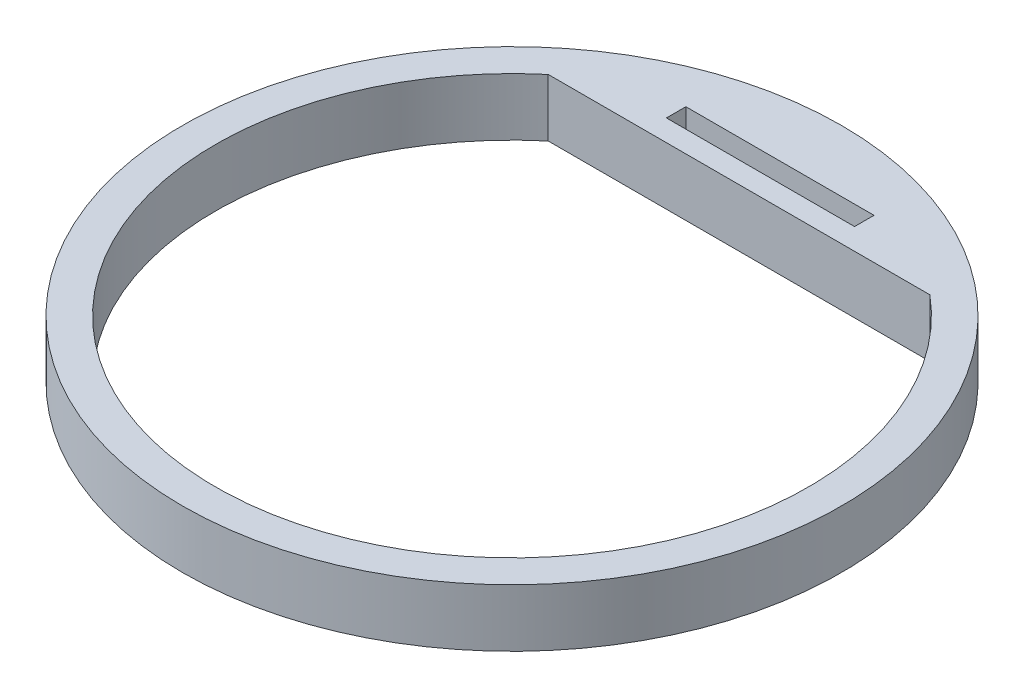
ISO-10303-21;
HEADER;
FILE_DESCRIPTION(('STEP AP214'),'2;1');
FILE_NAME('part.step','',(''),(''),'','','');
FILE_SCHEMA(('AUTOMOTIVE_DESIGN { 1 0 10303 214 1 1 1 1 }'));
ENDSEC;
DATA;
#1=APPLICATION_CONTEXT('core data for automotive mechanical design processes');
#2=APPLICATION_PROTOCOL_DEFINITION('international standard','automotive_design',2000,#1);
#3=PRODUCT_CONTEXT('',#1,'mechanical');
#4=PRODUCT('Part','Part','',(#3));
#5=PRODUCT_RELATED_PRODUCT_CATEGORY('part','',(#4));
#6=PRODUCT_DEFINITION_FORMATION('','',#4);
#7=PRODUCT_DEFINITION_CONTEXT('part definition',#1,'design');
#8=PRODUCT_DEFINITION('design','',#6,#7);
#9=PRODUCT_DEFINITION_SHAPE('','',#8);
#10=(LENGTH_UNIT() NAMED_UNIT(*) SI_UNIT(.MILLI.,.METRE.));
#11=(NAMED_UNIT(*) PLANE_ANGLE_UNIT() SI_UNIT($,.RADIAN.));
#12=(NAMED_UNIT(*) SI_UNIT($,.STERADIAN.) SOLID_ANGLE_UNIT());
#13=UNCERTAINTY_MEASURE_WITH_UNIT(LENGTH_MEASURE(1.E-05),#10,'distance_accuracy_value','');
#14=(GEOMETRIC_REPRESENTATION_CONTEXT(3) GLOBAL_UNCERTAINTY_ASSIGNED_CONTEXT((#13)) GLOBAL_UNIT_ASSIGNED_CONTEXT((#10,
#11,#12)) REPRESENTATION_CONTEXT('',''));
#15=CARTESIAN_POINT('',(0.,0.,0.));
#16=DIRECTION('',(0.,0.,1.));
#17=DIRECTION('',(1.,0.,0.));
#18=AXIS2_PLACEMENT_3D('',#15,#16,#17);
#19=CARTESIAN_POINT('',(0.,8.89,0.));
#20=DIRECTION('',(0.,-1.,0.));
#21=DIRECTION('',(0.,0.,-1.));
#22=AXIS2_PLACEMENT_3D('',#19,#20,#21);
#23=CYLINDRICAL_SURFACE('',#22,45.72);
#24=CARTESIAN_POINT('',(0.,0.,0.));
#25=DIRECTION('',(0.,1.,0.));
#26=DIRECTION('',(0.,0.,1.));
#27=AXIS2_PLACEMENT_3D('',#24,#25,#26);
#28=CIRCLE('',#27,45.72);
#29=CARTESIAN_POINT('',(-29.4162948040707,0.,-35.));
#30=VERTEX_POINT('',#29);
#31=CARTESIAN_POINT('',(29.4162948040707,0.,-35.));
#32=VERTEX_POINT('',#31);
#33=EDGE_CURVE('E113',#30,#32,#28,.T.);
#34=ORIENTED_EDGE('',*,*,#33,.F.);
#35=DIRECTION('',(0.,-1.,0.));
#36=VECTOR('',#35,1.);
#37=CARTESIAN_POINT('',(-29.4162948040707,8.89,-35.));
#38=LINE('',#37,#36);
#39=CARTESIAN_POINT('',(-29.4162948040707,8.89,-35.));
#40=VERTEX_POINT('',#39);
#41=EDGE_CURVE('E135',#40,#30,#38,.T.);
#42=ORIENTED_EDGE('',*,*,#41,.F.);
#43=CARTESIAN_POINT('',(0.,8.89,0.));
#44=DIRECTION('',(0.,1.,0.));
#45=DIRECTION('',(0.,0.,1.));
#46=AXIS2_PLACEMENT_3D('',#43,#44,#45);
#47=CIRCLE('',#46,45.72);
#48=CARTESIAN_POINT('',(29.4162948040707,8.89,-35.));
#49=VERTEX_POINT('',#48);
#50=EDGE_CURVE('E116',#40,#49,#47,.T.);
#51=ORIENTED_EDGE('',*,*,#50,.T.);
#52=DIRECTION('',(0.,-1.,0.));
#53=VECTOR('',#52,1.);
#54=CARTESIAN_POINT('',(29.4162948040707,8.89,-35.));
#55=LINE('',#54,#53);
#56=EDGE_CURVE('E126',#49,#32,#55,.T.);
#57=ORIENTED_EDGE('',*,*,#56,.T.);
#58=EDGE_LOOP('',(#34,#42,#51,#57));
#59=FACE_BOUND('',#58,.T.);
#60=ADVANCED_FACE('F35',(#59),#23,.F.);
#61=CARTESIAN_POINT('',(0.,8.89,-35.));
#62=DIRECTION('',(0.,0.,1.));
#63=DIRECTION('',(1.,0.,0.));
#64=AXIS2_PLACEMENT_3D('',#61,#62,#63);
#65=PLANE('',#64);
#66=DIRECTION('',(-1.,0.,0.));
#67=VECTOR('',#66,1.);
#68=CARTESIAN_POINT('',(0.,0.,-35.));
#69=LINE('',#68,#67);
#70=EDGE_CURVE('E129',#32,#30,#69,.T.);
#71=ORIENTED_EDGE('',*,*,#70,.F.);
#72=ORIENTED_EDGE('',*,*,#56,.F.);
#73=DIRECTION('',(-1.,0.,0.));
#74=VECTOR('',#73,1.);
#75=CARTESIAN_POINT('',(0.,8.89,-35.));
#76=LINE('',#75,#74);
#77=EDGE_CURVE('E119',#49,#40,#76,.T.);
#78=ORIENTED_EDGE('',*,*,#77,.T.);
#79=ORIENTED_EDGE('',*,*,#41,.T.);
#80=EDGE_LOOP('',(#71,#72,#78,#79));
#81=FACE_BOUND('',#80,.T.);
#82=ADVANCED_FACE('F158',(#81),#65,.T.);
#83=CARTESIAN_POINT('',(0.,8.89,0.));
#84=DIRECTION('',(0.,-1.,0.));
#85=DIRECTION('',(0.,0.,-1.));
#86=AXIS2_PLACEMENT_3D('',#83,#84,#85);
#87=CYLINDRICAL_SURFACE('',#86,50.8);
#88=CARTESIAN_POINT('',(0.,8.89,0.));
#89=DIRECTION('',(0.,1.,0.));
#90=DIRECTION('',(0.,0.,1.));
#91=AXIS2_PLACEMENT_3D('',#88,#89,#90);
#92=CIRCLE('',#91,50.8);
#93=CARTESIAN_POINT('',(0.,8.89,-50.8));
#94=VERTEX_POINT('',#93);
#95=EDGE_CURVE('E123',#94,#94,#92,.T.);
#96=CARTESIAN_POINT('',(0.,0.,0.));
#97=DIRECTION('',(0.,1.,0.));
#98=DIRECTION('',(0.,0.,1.));
#99=AXIS2_PLACEMENT_3D('',#96,#97,#98);
#100=CIRCLE('',#99,50.8);
#101=CARTESIAN_POINT('',(0.,0.,-50.8));
#102=VERTEX_POINT('',#101);
#103=EDGE_CURVE('E120',#102,#102,#100,.T.);
#104=CARTESIAN_POINT('',(0.,8.89,-50.8));
#105=CARTESIAN_POINT('',(0.,8.79739583333333,-50.8));
#106=CARTESIAN_POINT('',(0.,8.70479166666667,-50.8));
#107=CARTESIAN_POINT('',(0.,8.51958333333333,-50.8));
#108=CARTESIAN_POINT('',(0.,8.42697916666667,-50.8));
#109=CARTESIAN_POINT('',(0.,8.24177083333333,-50.8));
#110=CARTESIAN_POINT('',(0.,8.14916666666667,-50.8));
#111=CARTESIAN_POINT('',(0.,7.96395833333333,-50.8));
#112=CARTESIAN_POINT('',(0.,7.87135416666667,-50.8));
#113=CARTESIAN_POINT('',(0.,7.68614583333333,-50.8));
#114=CARTESIAN_POINT('',(0.,7.59354166666667,-50.8));
#115=CARTESIAN_POINT('',(0.,7.40833333333333,-50.8));
#116=CARTESIAN_POINT('',(0.,7.31572916666667,-50.8));
#117=CARTESIAN_POINT('',(0.,7.13052083333333,-50.8));
#118=CARTESIAN_POINT('',(0.,7.03791666666667,-50.8));
#119=CARTESIAN_POINT('',(0.,6.85270833333333,-50.8));
#120=CARTESIAN_POINT('',(0.,6.76010416666667,-50.8));
#121=CARTESIAN_POINT('',(0.,6.57489583333333,-50.8));
#122=CARTESIAN_POINT('',(0.,6.48229166666667,-50.8));
#123=CARTESIAN_POINT('',(0.,6.29708333333333,-50.8));
#124=CARTESIAN_POINT('',(0.,6.20447916666667,-50.8));
#125=CARTESIAN_POINT('',(0.,6.01927083333333,-50.8));
#126=CARTESIAN_POINT('',(0.,5.92666666666667,-50.8));
#127=CARTESIAN_POINT('',(0.,5.74145833333333,-50.8));
#128=CARTESIAN_POINT('',(0.,5.64885416666667,-50.8));
#129=CARTESIAN_POINT('',(0.,5.46364583333333,-50.8));
#130=CARTESIAN_POINT('',(0.,5.37104166666667,-50.8));
#131=CARTESIAN_POINT('',(0.,5.18583333333333,-50.8));
#132=CARTESIAN_POINT('',(0.,5.09322916666667,-50.8));
#133=CARTESIAN_POINT('',(0.,4.90802083333333,-50.8));
#134=CARTESIAN_POINT('',(0.,4.81541666666667,-50.8));
#135=CARTESIAN_POINT('',(0.,4.63020833333333,-50.8));
#136=CARTESIAN_POINT('',(0.,4.53760416666667,-50.8));
#137=CARTESIAN_POINT('',(0.,4.35239583333333,-50.8));
#138=CARTESIAN_POINT('',(0.,4.25979166666667,-50.8));
#139=CARTESIAN_POINT('',(0.,4.07458333333333,-50.8));
#140=CARTESIAN_POINT('',(0.,3.98197916666667,-50.8));
#141=CARTESIAN_POINT('',(0.,3.79677083333333,-50.8));
#142=CARTESIAN_POINT('',(0.,3.70416666666667,-50.8));
#143=CARTESIAN_POINT('',(0.,3.51895833333333,-50.8));
#144=CARTESIAN_POINT('',(0.,3.42635416666667,-50.8));
#145=CARTESIAN_POINT('',(0.,3.24114583333333,-50.8));
#146=CARTESIAN_POINT('',(0.,3.14854166666667,-50.8));
#147=CARTESIAN_POINT('',(0.,2.96333333333333,-50.8));
#148=CARTESIAN_POINT('',(0.,2.87072916666667,-50.8));
#149=CARTESIAN_POINT('',(0.,2.68552083333333,-50.8));
#150=CARTESIAN_POINT('',(0.,2.59291666666667,-50.8));
#151=CARTESIAN_POINT('',(0.,2.40770833333333,-50.8));
#152=CARTESIAN_POINT('',(0.,2.31510416666667,-50.8));
#153=CARTESIAN_POINT('',(0.,2.12989583333333,-50.8));
#154=CARTESIAN_POINT('',(0.,2.03729166666667,-50.8));
#155=CARTESIAN_POINT('',(0.,1.85208333333333,-50.8));
#156=CARTESIAN_POINT('',(0.,1.75947916666667,-50.8));
#157=CARTESIAN_POINT('',(0.,1.57427083333333,-50.8));
#158=CARTESIAN_POINT('',(0.,1.48166666666667,-50.8));
#159=CARTESIAN_POINT('',(0.,1.29645833333333,-50.8));
#160=CARTESIAN_POINT('',(0.,1.20385416666667,-50.8));
#161=CARTESIAN_POINT('',(0.,1.01864583333333,-50.8));
#162=CARTESIAN_POINT('',(0.,0.926041666666667,-50.8));
#163=CARTESIAN_POINT('',(0.,0.740833333333334,-50.8));
#164=CARTESIAN_POINT('',(0.,0.648229166666667,-50.8));
#165=CARTESIAN_POINT('',(0.,0.463020833333334,-50.8));
#166=CARTESIAN_POINT('',(0.,0.370416666666667,-50.8));
#167=CARTESIAN_POINT('',(0.,0.185208333333334,-50.8));
#168=CARTESIAN_POINT('',(0.,0.0926041666666669,-50.8));
#169=CARTESIAN_POINT('',(0.,0.,-50.8));
#170=B_SPLINE_CURVE_WITH_KNOTS('',3,(#104,#105,#106,#107,#108,#109,#110,#111,#112,#113,#114,
#115,#116,#117,#118,#119,#120,#121,#122,#123,#124,#125,#126,#127,#128,#129,#130,#131,#132,#133,
#134,#135,#136,#137,#138,#139,#140,#141,#142,#143,#144,#145,#146,#147,#148,#149,#150,#151,#152,
#153,#154,#155,#156,#157,#158,#159,#160,#161,#162,#163,#164,#165,#166,#167,#168,#169),
.UNSPECIFIED.,.F.,.F.,(4,2,2,2,2,2,2,2,2,2,2,2,2,2,2,2,2,2,2,2,2,2,2,2,2,2,2,2,2,2,2,2,4),(0.,
0.2778125,0.555625000000001,0.833437500000001,1.11125,1.3890625,1.666875,1.9446875,2.2225,
2.5003125,2.778125,3.0559375,3.33375,3.6115625,3.889375,4.1671875,4.445,4.7228125,5.000625,
5.2784375,5.55625,5.8340625,6.111875,6.3896875,6.6675,6.9453125,7.223125,7.5009375,7.77875,
8.0565625,8.334375,8.6121875,8.89),.UNSPECIFIED.);
#171=EDGE_CURVE('BSEAM163',#94,#102,#170,.T.);
#172=ORIENTED_EDGE('',*,*,#95,.F.);
#173=ORIENTED_EDGE('',*,*,#103,.T.);
#174=ORIENTED_EDGE('',*,*,#171,.T.);
#175=ORIENTED_EDGE('',*,*,#171,.F.);
#176=EDGE_LOOP('',(#172,#174,#173,#175));
#177=FACE_BOUND('',#176,.T.);
#178=ADVANCED_FACE('F163',(#177),#87,.T.);
#179=CARTESIAN_POINT('',(0.,8.89,0.));
#180=DIRECTION('',(0.,1.,0.));
#181=DIRECTION('',(0.,0.,1.));
#182=AXIS2_PLACEMENT_3D('',#179,#180,#181);
#183=PLANE('',#182);
#184=DIRECTION('',(0.,0.,-1.));
#185=VECTOR('',#184,1.);
#186=CARTESIAN_POINT('',(14.5,8.89,-41.3));
#187=LINE('',#186,#185);
#188=CARTESIAN_POINT('',(14.5,8.89,-38.3));
#189=VERTEX_POINT('',#188);
#190=CARTESIAN_POINT('',(14.5,8.89,-41.3));
#191=VERTEX_POINT('',#190);
#192=EDGE_CURVE('E49',#189,#191,#187,.T.);
#193=ORIENTED_EDGE('',*,*,#192,.F.);
#194=DIRECTION('',(1.,0.,0.));
#195=VECTOR('',#194,1.);
#196=CARTESIAN_POINT('',(14.5,8.89,-38.3));
#197=LINE('',#196,#195);
#198=CARTESIAN_POINT('',(-14.5,8.89,-38.3));
#199=VERTEX_POINT('',#198);
#200=EDGE_CURVE('E106',#199,#189,#197,.T.);
#201=ORIENTED_EDGE('',*,*,#200,.F.);
#202=DIRECTION('',(0.,0.,1.));
#203=VECTOR('',#202,1.);
#204=CARTESIAN_POINT('',(-14.5,8.89,-41.3));
#205=LINE('',#204,#203);
#206=CARTESIAN_POINT('',(-14.5,8.89,-41.3));
#207=VERTEX_POINT('',#206);
#208=EDGE_CURVE('E90',#207,#199,#205,.T.);
#209=ORIENTED_EDGE('',*,*,#208,.F.);
#210=DIRECTION('',(-1.,0.,0.));
#211=VECTOR('',#210,1.);
#212=CARTESIAN_POINT('',(-14.5,8.89,-41.3));
#213=LINE('',#212,#211);
#214=EDGE_CURVE('E99',#191,#207,#213,.T.);
#215=ORIENTED_EDGE('',*,*,#214,.F.);
#216=EDGE_LOOP('',(#193,#201,#209,#215));
#217=FACE_BOUND('',#216,.T.);
#218=ORIENTED_EDGE('',*,*,#50,.F.);
#219=ORIENTED_EDGE('',*,*,#77,.F.);
#220=EDGE_LOOP('',(#218,#219));
#221=FACE_BOUND('',#220,.T.);
#222=ORIENTED_EDGE('',*,*,#95,.T.);
#223=EDGE_LOOP('',(#222));
#224=FACE_BOUND('',#223,.T.);
#225=ADVANCED_FACE('F103',(#217,#221,#224),#183,.T.);
#226=CARTESIAN_POINT('',(0.,0.,0.));
#227=DIRECTION('',(0.,1.,0.));
#228=DIRECTION('',(0.,0.,1.));
#229=AXIS2_PLACEMENT_3D('',#226,#227,#228);
#230=PLANE('',#229);
#231=DIRECTION('',(1.,0.,0.));
#232=VECTOR('',#231,1.);
#233=CARTESIAN_POINT('',(0.,0.,-38.3));
#234=LINE('',#233,#232);
#235=CARTESIAN_POINT('',(-14.5,0.,-38.3));
#236=VERTEX_POINT('',#235);
#237=CARTESIAN_POINT('',(14.5,0.,-38.3));
#238=VERTEX_POINT('',#237);
#239=EDGE_CURVE('E42',#236,#238,#234,.T.);
#240=ORIENTED_EDGE('',*,*,#239,.T.);
#241=DIRECTION('',(0.,0.,-1.));
#242=VECTOR('',#241,1.);
#243=CARTESIAN_POINT('',(14.5,0.,0.));
#244=LINE('',#243,#242);
#245=CARTESIAN_POINT('',(14.5,0.,-41.3));
#246=VERTEX_POINT('',#245);
#247=EDGE_CURVE('E11',#238,#246,#244,.T.);
#248=ORIENTED_EDGE('',*,*,#247,.T.);
#249=DIRECTION('',(-1.,0.,0.));
#250=VECTOR('',#249,1.);
#251=CARTESIAN_POINT('',(0.,0.,-41.3));
#252=LINE('',#251,#250);
#253=CARTESIAN_POINT('',(-14.5,0.,-41.3));
#254=VERTEX_POINT('',#253);
#255=EDGE_CURVE('E137',#246,#254,#252,.T.);
#256=ORIENTED_EDGE('',*,*,#255,.T.);
#257=DIRECTION('',(0.,0.,1.));
#258=VECTOR('',#257,1.);
#259=CARTESIAN_POINT('',(-14.5,0.,0.));
#260=LINE('',#259,#258);
#261=EDGE_CURVE('E93',#254,#236,#260,.T.);
#262=ORIENTED_EDGE('',*,*,#261,.T.);
#263=EDGE_LOOP('',(#240,#248,#256,#262));
#264=FACE_BOUND('',#263,.T.);
#265=ORIENTED_EDGE('',*,*,#33,.T.);
#266=ORIENTED_EDGE('',*,*,#70,.T.);
#267=EDGE_LOOP('',(#265,#266));
#268=FACE_BOUND('',#267,.T.);
#269=ORIENTED_EDGE('',*,*,#103,.F.);
#270=EDGE_LOOP('',(#269));
#271=FACE_BOUND('',#270,.T.);
#272=ADVANCED_FACE('F141',(#264,#268,#271),#230,.F.);
#273=CARTESIAN_POINT('',(14.5,-118.11,-41.3));
#274=DIRECTION('',(1.,0.,0.));
#275=DIRECTION('',(0.,0.,-1.));
#276=AXIS2_PLACEMENT_3D('',#273,#274,#275);
#277=PLANE('',#276);
#278=DIRECTION('',(0.,1.,0.));
#279=VECTOR('',#278,1.);
#280=CARTESIAN_POINT('',(14.5,-118.11,-38.3));
#281=LINE('',#280,#279);
#282=EDGE_CURVE('E111',#238,#189,#281,.T.);
#283=ORIENTED_EDGE('',*,*,#282,.T.);
#284=ORIENTED_EDGE('',*,*,#192,.T.);
#285=DIRECTION('',(0.,1.,0.));
#286=VECTOR('',#285,1.);
#287=CARTESIAN_POINT('',(14.5,-118.11,-41.3));
#288=LINE('',#287,#286);
#289=EDGE_CURVE('E96',#246,#191,#288,.T.);
#290=ORIENTED_EDGE('',*,*,#289,.F.);
#291=ORIENTED_EDGE('',*,*,#247,.F.);
#292=EDGE_LOOP('',(#283,#284,#290,#291));
#293=FACE_BOUND('',#292,.T.);
#294=ADVANCED_FACE('F146',(#293),#277,.F.);
#295=CARTESIAN_POINT('',(14.5,-118.11,-38.3));
#296=DIRECTION('',(0.,0.,1.));
#297=DIRECTION('',(1.,0.,0.));
#298=AXIS2_PLACEMENT_3D('',#295,#296,#297);
#299=PLANE('',#298);
#300=DIRECTION('',(0.,1.,0.));
#301=VECTOR('',#300,1.);
#302=CARTESIAN_POINT('',(-14.5,-118.11,-38.3));
#303=LINE('',#302,#301);
#304=EDGE_CURVE('E95',#236,#199,#303,.T.);
#305=ORIENTED_EDGE('',*,*,#304,.T.);
#306=ORIENTED_EDGE('',*,*,#200,.T.);
#307=ORIENTED_EDGE('',*,*,#282,.F.);
#308=ORIENTED_EDGE('',*,*,#239,.F.);
#309=EDGE_LOOP('',(#305,#306,#307,#308));
#310=FACE_BOUND('',#309,.T.);
#311=ADVANCED_FACE('F145',(#310),#299,.F.);
#312=CARTESIAN_POINT('',(-14.5,-118.11,-41.3));
#313=DIRECTION('',(-1.,0.,0.));
#314=DIRECTION('',(0.,0.,1.));
#315=AXIS2_PLACEMENT_3D('',#312,#313,#314);
#316=PLANE('',#315);
#317=DIRECTION('',(0.,1.,0.));
#318=VECTOR('',#317,1.);
#319=CARTESIAN_POINT('',(-14.5,-118.11,-41.3));
#320=LINE('',#319,#318);
#321=EDGE_CURVE('E57',#254,#207,#320,.T.);
#322=ORIENTED_EDGE('',*,*,#321,.T.);
#323=ORIENTED_EDGE('',*,*,#208,.T.);
#324=ORIENTED_EDGE('',*,*,#304,.F.);
#325=ORIENTED_EDGE('',*,*,#261,.F.);
#326=EDGE_LOOP('',(#322,#323,#324,#325));
#327=FACE_BOUND('',#326,.T.);
#328=ADVANCED_FACE('F87',(#327),#316,.F.);
#329=CARTESIAN_POINT('',(-14.5,-118.11,-41.3));
#330=DIRECTION('',(0.,0.,-1.));
#331=DIRECTION('',(-1.,0.,0.));
#332=AXIS2_PLACEMENT_3D('',#329,#330,#331);
#333=PLANE('',#332);
#334=ORIENTED_EDGE('',*,*,#289,.T.);
#335=ORIENTED_EDGE('',*,*,#214,.T.);
#336=ORIENTED_EDGE('',*,*,#321,.F.);
#337=ORIENTED_EDGE('',*,*,#255,.F.);
#338=EDGE_LOOP('',(#334,#335,#336,#337));
#339=FACE_BOUND('',#338,.T.);
#340=ADVANCED_FACE('F100',(#339),#333,.F.);
#341=CLOSED_SHELL('',(#60,#82,#178,#225,#272,#294,#311,#328,#340));
#342=MANIFOLD_SOLID_BREP('B2',#341);
#343=ADVANCED_BREP_SHAPE_REPRESENTATION('',(#18,#342),#14);
#344=SHAPE_DEFINITION_REPRESENTATION(#9,#343);
ENDSEC;
END-ISO-10303-21;
